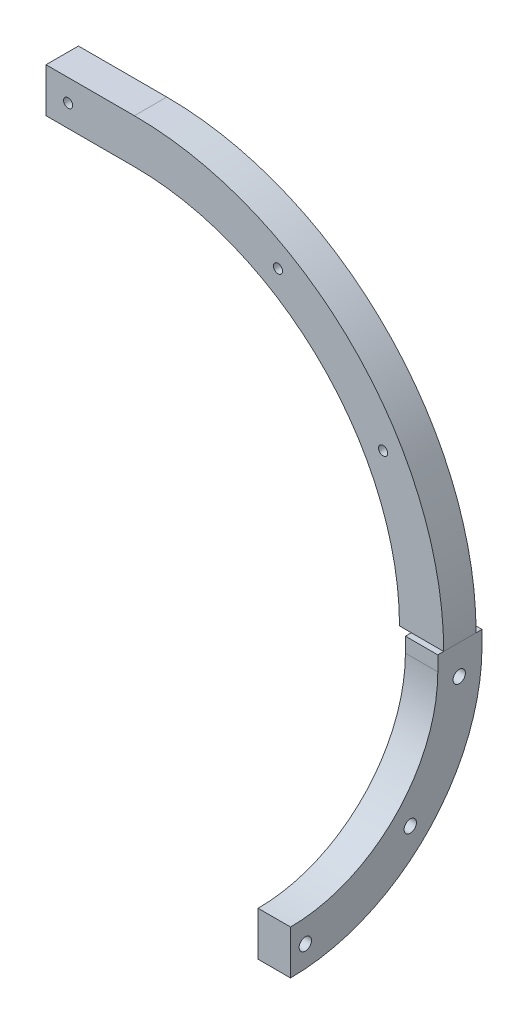
ISO-10303-21;
HEADER;
FILE_DESCRIPTION(('STEP AP214'),'2;1');
FILE_NAME('part.step','',(''),(''),'','','');
FILE_SCHEMA(('AUTOMOTIVE_DESIGN { 1 0 10303 214 1 1 1 1 }'));
ENDSEC;
DATA;
#1=APPLICATION_CONTEXT('core data for automotive mechanical design processes');
#2=APPLICATION_PROTOCOL_DEFINITION('international standard','automotive_design',2000,#1);
#3=PRODUCT_CONTEXT('',#1,'mechanical');
#4=PRODUCT('Part','Part','',(#3));
#5=PRODUCT_RELATED_PRODUCT_CATEGORY('part','',(#4));
#6=PRODUCT_DEFINITION_FORMATION('','',#4);
#7=PRODUCT_DEFINITION_CONTEXT('part definition',#1,'design');
#8=PRODUCT_DEFINITION('design','',#6,#7);
#9=PRODUCT_DEFINITION_SHAPE('','',#8);
#10=(LENGTH_UNIT() NAMED_UNIT(*) SI_UNIT(.MILLI.,.METRE.));
#11=(NAMED_UNIT(*) PLANE_ANGLE_UNIT() SI_UNIT($,.RADIAN.));
#12=(NAMED_UNIT(*) SI_UNIT($,.STERADIAN.) SOLID_ANGLE_UNIT());
#13=UNCERTAINTY_MEASURE_WITH_UNIT(LENGTH_MEASURE(1.E-05),#10,'distance_accuracy_value','');
#14=(GEOMETRIC_REPRESENTATION_CONTEXT(3) GLOBAL_UNCERTAINTY_ASSIGNED_CONTEXT((#13)) GLOBAL_UNIT_ASSIGNED_CONTEXT((#10,
#11,#12)) REPRESENTATION_CONTEXT('',''));
#15=CARTESIAN_POINT('',(0.,0.,0.));
#16=DIRECTION('',(0.,0.,1.));
#17=DIRECTION('',(1.,0.,0.));
#18=AXIS2_PLACEMENT_3D('',#15,#16,#17);
#19=CARTESIAN_POINT('',(0.,-45.6586399182266,9.3413600817736));
#20=DIRECTION('',(1.,0.,0.));
#21=DIRECTION('',(0.,0.,1.));
#22=AXIS2_PLACEMENT_3D('',#19,#20,#21);
#23=CYLINDRICAL_SURFACE('',#22,1.55);
#24=CARTESIAN_POINT('',(94.,-45.6586399182266,9.3413600817736));
#25=DIRECTION('',(1.,0.,0.));
#26=DIRECTION('',(0.,0.,-1.));
#27=AXIS2_PLACEMENT_3D('',#24,#25,#26);
#28=CIRCLE('',#27,1.55);
#29=CARTESIAN_POINT('',(94.,-45.6586399182266,7.7913600817736));
#30=VERTEX_POINT('',#29);
#31=EDGE_CURVE('E254',#30,#30,#28,.F.);
#32=ORIENTED_EDGE('',*,*,#31,.T.);
#33=EDGE_LOOP('',(#32));
#34=FACE_BOUND('',#33,.T.);
#35=CARTESIAN_POINT('',(100.5,-45.6586399182266,9.3413600817736));
#36=DIRECTION('',(-1.,0.,0.));
#37=DIRECTION('',(0.,0.,1.));
#38=AXIS2_PLACEMENT_3D('',#35,#36,#37);
#39=CIRCLE('',#38,1.55);
#40=CARTESIAN_POINT('',(100.5,-45.6586399182266,10.8913600817736));
#41=VERTEX_POINT('',#40);
#42=EDGE_CURVE('E177',#41,#41,#39,.F.);
#43=ORIENTED_EDGE('',*,*,#42,.T.);
#44=EDGE_LOOP('',(#43));
#45=FACE_BOUND('',#44,.T.);
#46=ADVANCED_FACE('F47',(#34,#45),#23,.F.);
#47=CARTESIAN_POINT('',(0.,-10.01145520799,-7.2811951402754));
#48=DIRECTION('',(1.,0.,0.));
#49=DIRECTION('',(0.,0.,1.));
#50=AXIS2_PLACEMENT_3D('',#47,#48,#49);
#51=CYLINDRICAL_SURFACE('',#50,1.55);
#52=CARTESIAN_POINT('',(94.,-10.01145520799,-7.2811951402754));
#53=DIRECTION('',(1.,0.,0.));
#54=DIRECTION('',(0.,0.,-1.));
#55=AXIS2_PLACEMENT_3D('',#52,#53,#54);
#56=CIRCLE('',#55,1.55);
#57=CARTESIAN_POINT('',(94.,-10.01145520799,-8.8311951402754));
#58=VERTEX_POINT('',#57);
#59=EDGE_CURVE('E250',#58,#58,#56,.F.);
#60=ORIENTED_EDGE('',*,*,#59,.T.);
#61=EDGE_LOOP('',(#60));
#62=FACE_BOUND('',#61,.T.);
#63=CARTESIAN_POINT('',(100.5,-10.01145520799,-7.2811951402754));
#64=DIRECTION('',(-1.,0.,0.));
#65=DIRECTION('',(0.,0.,1.));
#66=AXIS2_PLACEMENT_3D('',#63,#64,#65);
#67=CIRCLE('',#66,1.55);
#68=CARTESIAN_POINT('',(100.5,-10.01145520799,-5.7311951402754));
#69=VERTEX_POINT('',#68);
#70=EDGE_CURVE('E187',#69,#69,#67,.F.);
#71=ORIENTED_EDGE('',*,*,#70,.T.);
#72=EDGE_LOOP('',(#71));
#73=FACE_BOUND('',#72,.T.);
#74=ADVANCED_FACE('F332',(#62,#73),#51,.F.);
#75=CARTESIAN_POINT('',(0.,-62.5,44.9694018472598));
#76=DIRECTION('',(1.,0.,0.));
#77=DIRECTION('',(0.,0.,1.));
#78=AXIS2_PLACEMENT_3D('',#75,#76,#77);
#79=CYLINDRICAL_SURFACE('',#78,1.55);
#80=CARTESIAN_POINT('',(94.,-62.5,44.9694018472598));
#81=DIRECTION('',(1.,0.,0.));
#82=DIRECTION('',(0.,0.,-1.));
#83=AXIS2_PLACEMENT_3D('',#80,#81,#82);
#84=CIRCLE('',#83,1.55);
#85=CARTESIAN_POINT('',(94.,-62.5,43.4194018472598));
#86=VERTEX_POINT('',#85);
#87=EDGE_CURVE('E158',#86,#86,#84,.F.);
#88=ORIENTED_EDGE('',*,*,#87,.T.);
#89=EDGE_LOOP('',(#88));
#90=FACE_BOUND('',#89,.T.);
#91=CARTESIAN_POINT('',(100.5,-62.5,44.9694018472598));
#92=DIRECTION('',(-1.,0.,0.));
#93=DIRECTION('',(0.,0.,1.));
#94=AXIS2_PLACEMENT_3D('',#91,#92,#93);
#95=CIRCLE('',#94,1.55);
#96=CARTESIAN_POINT('',(100.5,-62.5,46.5194018472598));
#97=VERTEX_POINT('',#96);
#98=EDGE_CURVE('E322',#97,#97,#95,.F.);
#99=ORIENTED_EDGE('',*,*,#98,.T.);
#100=EDGE_LOOP('',(#99));
#101=FACE_BOUND('',#100,.T.);
#102=ADVANCED_FACE('F358',(#90,#101),#79,.F.);
#103=CARTESIAN_POINT('',(0.,0.,0.));
#104=DIRECTION('',(0.,0.,1.));
#105=DIRECTION('',(-1.,0.,0.));
#106=AXIS2_PLACEMENT_3D('',#103,#104,#105);
#107=PLANE('',#106);
#108=DIRECTION('',(1.,0.,0.));
#109=VECTOR('',#108,1.);
#110=CARTESIAN_POINT('',(90.,-5.,0.));
#111=LINE('',#110,#109);
#112=CARTESIAN_POINT('',(94.,-5.,0.));
#113=VERTEX_POINT('',#112);
#114=CARTESIAN_POINT('',(105.,-5.,0.));
#115=VERTEX_POINT('',#114);
#116=EDGE_CURVE('E169',#113,#115,#111,.T.);
#117=ORIENTED_EDGE('',*,*,#116,.T.);
#118=DIRECTION('',(0.,1.,0.));
#119=VECTOR('',#118,1.);
#120=CARTESIAN_POINT('',(105.,-5.,0.));
#121=LINE('',#120,#119);
#122=CARTESIAN_POINT('',(105.,0.,0.));
#123=VERTEX_POINT('',#122);
#124=EDGE_CURVE('E299',#115,#123,#121,.T.);
#125=ORIENTED_EDGE('',*,*,#124,.T.);
#126=DIRECTION('',(1.,0.,0.));
#127=VECTOR('',#126,1.);
#128=CARTESIAN_POINT('',(90.,0.,0.));
#129=LINE('',#128,#127);
#130=CARTESIAN_POINT('',(94.,0.,0.));
#131=VERTEX_POINT('',#130);
#132=EDGE_CURVE('E223',#131,#123,#129,.T.);
#133=ORIENTED_EDGE('',*,*,#132,.F.);
#134=DIRECTION('',(0.,1.,0.));
#135=VECTOR('',#134,1.);
#136=CARTESIAN_POINT('',(94.,0.,0.));
#137=LINE('',#136,#135);
#138=EDGE_CURVE('E193',#113,#131,#137,.T.);
#139=ORIENTED_EDGE('',*,*,#138,.F.);
#140=EDGE_LOOP('',(#117,#125,#133,#139));
#141=FACE_BOUND('',#140,.T.);
#142=ADVANCED_FACE('F391',(#141),#107,.T.);
#143=CARTESIAN_POINT('',(0.,0.,-15.));
#144=DIRECTION('',(0.,0.,1.));
#145=DIRECTION('',(-1.,0.,0.));
#146=AXIS2_PLACEMENT_3D('',#143,#144,#145);
#147=PLANE('',#146);
#148=DIRECTION('',(0.,-1.,0.));
#149=VECTOR('',#148,1.);
#150=CARTESIAN_POINT('',(94.,0.,-15.));
#151=LINE('',#150,#149);
#152=CARTESIAN_POINT('',(94.,0.,-15.));
#153=VERTEX_POINT('',#152);
#154=CARTESIAN_POINT('',(94.,-5.,-15.));
#155=VERTEX_POINT('',#154);
#156=EDGE_CURVE('E165',#153,#155,#151,.T.);
#157=ORIENTED_EDGE('',*,*,#156,.F.);
#158=DIRECTION('',(1.,0.,0.));
#159=VECTOR('',#158,1.);
#160=CARTESIAN_POINT('',(90.,0.,-15.));
#161=LINE('',#160,#159);
#162=CARTESIAN_POINT('',(105.,0.,-15.));
#163=VERTEX_POINT('',#162);
#164=EDGE_CURVE('E258',#153,#163,#161,.T.);
#165=ORIENTED_EDGE('',*,*,#164,.T.);
#166=DIRECTION('',(0.,1.,0.));
#167=VECTOR('',#166,1.);
#168=CARTESIAN_POINT('',(105.,-5.,-15.));
#169=LINE('',#168,#167);
#170=CARTESIAN_POINT('',(105.,-5.,-15.));
#171=VERTEX_POINT('',#170);
#172=EDGE_CURVE('E167',#171,#163,#169,.T.);
#173=ORIENTED_EDGE('',*,*,#172,.F.);
#174=DIRECTION('',(-1.,0.,0.));
#175=VECTOR('',#174,1.);
#176=CARTESIAN_POINT('',(90.,-5.,-15.));
#177=LINE('',#176,#175);
#178=EDGE_CURVE('E150',#171,#155,#177,.T.);
#179=ORIENTED_EDGE('',*,*,#178,.T.);
#180=EDGE_LOOP('',(#157,#165,#173,#179));
#181=FACE_BOUND('',#180,.T.);
#182=ADVANCED_FACE('F163',(#181),#147,.F.);
#183=CARTESIAN_POINT('',(90.,0.,-13.));
#184=DIRECTION('',(0.,-1.,0.));
#185=DIRECTION('',(0.,0.,1.));
#186=AXIS2_PLACEMENT_3D('',#183,#184,#185);
#187=PLANE('',#186);
#188=DIRECTION('',(0.,0.,-1.));
#189=VECTOR('',#188,1.);
#190=CARTESIAN_POINT('',(94.,0.,0.));
#191=LINE('',#190,#189);
#192=CARTESIAN_POINT('',(94.,0.,-13.));
#193=VERTEX_POINT('',#192);
#194=EDGE_CURVE('E174',#193,#153,#191,.T.);
#195=ORIENTED_EDGE('',*,*,#194,.F.);
#196=DIRECTION('',(1.,0.,0.));
#197=VECTOR('',#196,1.);
#198=CARTESIAN_POINT('',(90.,0.,-13.));
#199=LINE('',#198,#197);
#200=CARTESIAN_POINT('',(105.,0.,-13.));
#201=VERTEX_POINT('',#200);
#202=EDGE_CURVE('E267',#193,#201,#199,.T.);
#203=ORIENTED_EDGE('',*,*,#202,.T.);
#204=DIRECTION('',(0.,0.,1.));
#205=VECTOR('',#204,1.);
#206=CARTESIAN_POINT('',(105.,0.,-15.));
#207=LINE('',#206,#205);
#208=EDGE_CURVE('E303',#163,#201,#207,.T.);
#209=ORIENTED_EDGE('',*,*,#208,.F.);
#210=ORIENTED_EDGE('',*,*,#164,.F.);
#211=EDGE_LOOP('',(#195,#203,#209,#210));
#212=FACE_BOUND('',#211,.T.);
#213=ADVANCED_FACE('F390',(#212),#187,.F.);
#214=CARTESIAN_POINT('',(90.,0.,-2.));
#215=DIRECTION('',(0.,1.,0.));
#216=DIRECTION('',(0.,0.,-1.));
#217=AXIS2_PLACEMENT_3D('',#214,#215,#216);
#218=PLANE('',#217);
#219=ORIENTED_EDGE('',*,*,#132,.T.);
#220=DIRECTION('',(0.,0.,1.));
#221=VECTOR('',#220,1.);
#222=CARTESIAN_POINT('',(105.,0.,-2.));
#223=LINE('',#222,#221);
#224=CARTESIAN_POINT('',(105.,0.,-2.));
#225=VERTEX_POINT('',#224);
#226=EDGE_CURVE('E234',#225,#123,#223,.T.);
#227=ORIENTED_EDGE('',*,*,#226,.F.);
#228=DIRECTION('',(1.,0.,0.));
#229=VECTOR('',#228,1.);
#230=CARTESIAN_POINT('',(90.,0.,-2.));
#231=LINE('',#230,#229);
#232=CARTESIAN_POINT('',(94.,0.,-2.));
#233=VERTEX_POINT('',#232);
#234=EDGE_CURVE('E231',#233,#225,#231,.T.);
#235=ORIENTED_EDGE('',*,*,#234,.F.);
#236=EDGE_CURVE('E184',#131,#233,#191,.T.);
#237=ORIENTED_EDGE('',*,*,#236,.F.);
#238=EDGE_LOOP('',(#219,#227,#235,#237));
#239=FACE_BOUND('',#238,.T.);
#240=ADVANCED_FACE('F399',(#239),#218,.T.);
#241=CARTESIAN_POINT('',(0.,0.,-15.));
#242=DIRECTION('',(0.,0.,1.));
#243=DIRECTION('',(-1.,0.,0.));
#244=AXIS2_PLACEMENT_3D('',#241,#242,#243);
#245=CYLINDRICAL_SURFACE('',#244,105.);
#246=CARTESIAN_POINT('',(0.,0.,-2.));
#247=DIRECTION('',(0.,0.,1.));
#248=DIRECTION('',(-1.,0.,0.));
#249=AXIS2_PLACEMENT_3D('',#246,#247,#248);
#250=CIRCLE('',#249,105.);
#251=CARTESIAN_POINT('',(0.,105.,-2.));
#252=VERTEX_POINT('',#251);
#253=EDGE_CURVE('E224',#225,#252,#250,.T.);
#254=ORIENTED_EDGE('',*,*,#253,.F.);
#255=EDGE_CURVE('E73',#201,#225,#207,.T.);
#256=ORIENTED_EDGE('',*,*,#255,.F.);
#257=CARTESIAN_POINT('',(0.,0.,-13.));
#258=DIRECTION('',(0.,0.,1.));
#259=DIRECTION('',(-1.,0.,0.));
#260=AXIS2_PLACEMENT_3D('',#257,#258,#259);
#261=CIRCLE('',#260,105.);
#262=CARTESIAN_POINT('',(0.,105.,-13.));
#263=VERTEX_POINT('',#262);
#264=EDGE_CURVE('E259',#201,#263,#261,.T.);
#265=ORIENTED_EDGE('',*,*,#264,.T.);
#266=DIRECTION('',(0.,0.,1.));
#267=VECTOR('',#266,1.);
#268=CARTESIAN_POINT('',(0.,105.,-15.));
#269=LINE('',#268,#267);
#270=EDGE_CURVE('E11',#263,#252,#269,.T.);
#271=ORIENTED_EDGE('',*,*,#270,.T.);
#272=EDGE_LOOP('',(#254,#256,#265,#271));
#273=FACE_BOUND('',#272,.T.);
#274=ADVANCED_FACE('F49',(#273),#245,.T.);
#275=CARTESIAN_POINT('',(0.,0.,-15.));
#276=DIRECTION('',(0.,0.,1.));
#277=DIRECTION('',(-1.,0.,0.));
#278=AXIS2_PLACEMENT_3D('',#275,#276,#277);
#279=CYLINDRICAL_SURFACE('',#278,90.);
#280=CARTESIAN_POINT('',(0.,0.,-2.));
#281=DIRECTION('',(0.,0.,-1.));
#282=DIRECTION('',(-1.,0.,0.));
#283=AXIS2_PLACEMENT_3D('',#280,#281,#282);
#284=CIRCLE('',#283,90.);
#285=CARTESIAN_POINT('',(-3.14233320495882E-13,90.,-2.));
#286=VERTEX_POINT('',#285);
#287=CARTESIAN_POINT('',(90.,0.,-2.));
#288=VERTEX_POINT('',#287);
#289=EDGE_CURVE('E228',#286,#288,#284,.T.);
#290=ORIENTED_EDGE('',*,*,#289,.F.);
#291=DIRECTION('',(0.,0.,1.));
#292=VECTOR('',#291,1.);
#293=CARTESIAN_POINT('',(0.,90.,-15.));
#294=LINE('',#293,#292);
#295=CARTESIAN_POINT('',(-3.14233320495882E-13,90.,-13.));
#296=VERTEX_POINT('',#295);
#297=EDGE_CURVE('E57',#296,#286,#294,.T.);
#298=ORIENTED_EDGE('',*,*,#297,.F.);
#299=CARTESIAN_POINT('',(0.,0.,-13.));
#300=DIRECTION('',(0.,0.,-1.));
#301=DIRECTION('',(-1.,0.,0.));
#302=AXIS2_PLACEMENT_3D('',#299,#300,#301);
#303=CIRCLE('',#302,90.);
#304=CARTESIAN_POINT('',(90.,0.,-13.));
#305=VERTEX_POINT('',#304);
#306=EDGE_CURVE('E263',#296,#305,#303,.T.);
#307=ORIENTED_EDGE('',*,*,#306,.T.);
#308=DIRECTION('',(0.,0.,1.));
#309=VECTOR('',#308,1.);
#310=CARTESIAN_POINT('',(90.,0.,-15.));
#311=LINE('',#310,#309);
#312=EDGE_CURVE('E306',#305,#288,#311,.T.);
#313=ORIENTED_EDGE('',*,*,#312,.T.);
#314=EDGE_LOOP('',(#290,#298,#307,#313));
#315=FACE_BOUND('',#314,.T.);
#316=ADVANCED_FACE('F372',(#315),#279,.F.);
#317=CARTESIAN_POINT('',(84.4374768689824,48.7500000000007,50.));
#318=DIRECTION('',(0.,0.,-1.));
#319=DIRECTION('',(1.,0.,0.));
#320=AXIS2_PLACEMENT_3D('',#317,#318,#319);
#321=CYLINDRICAL_SURFACE('',#320,1.54999999999999);
#322=CARTESIAN_POINT('',(84.4374768689824,48.7500000000007,-13.));
#323=DIRECTION('',(0.,0.,-1.));
#324=DIRECTION('',(-1.,0.,0.));
#325=AXIS2_PLACEMENT_3D('',#322,#323,#324);
#326=CIRCLE('',#325,1.54999999999999);
#327=CARTESIAN_POINT('',(82.8874768689824,48.7500000000007,-13.));
#328=VERTEX_POINT('',#327);
#329=EDGE_CURVE('E275',#328,#328,#326,.F.);
#330=ORIENTED_EDGE('',*,*,#329,.F.);
#331=EDGE_LOOP('',(#330));
#332=FACE_BOUND('',#331,.T.);
#333=CARTESIAN_POINT('',(84.4374768689824,48.7500000000007,-2.));
#334=DIRECTION('',(0.,0.,-1.));
#335=DIRECTION('',(-1.,0.,0.));
#336=AXIS2_PLACEMENT_3D('',#333,#334,#335);
#337=CIRCLE('',#336,1.54999999999999);
#338=CARTESIAN_POINT('',(82.8874768689824,48.7500000000007,-2.));
#339=VERTEX_POINT('',#338);
#340=EDGE_CURVE('E241',#339,#339,#337,.F.);
#341=ORIENTED_EDGE('',*,*,#340,.T.);
#342=EDGE_LOOP('',(#341));
#343=FACE_BOUND('',#342,.T.);
#344=ADVANCED_FACE('F368',(#332,#343),#321,.F.);
#345=CARTESIAN_POINT('',(48.7500000000004,84.4374768689825,50.));
#346=DIRECTION('',(0.,0.,-1.));
#347=DIRECTION('',(1.,0.,0.));
#348=AXIS2_PLACEMENT_3D('',#345,#346,#347);
#349=CYLINDRICAL_SURFACE('',#348,1.54999999999999);
#350=CARTESIAN_POINT('',(48.7500000000004,84.4374768689825,-13.));
#351=DIRECTION('',(0.,0.,-1.));
#352=DIRECTION('',(-1.,0.,0.));
#353=AXIS2_PLACEMENT_3D('',#350,#351,#352);
#354=CIRCLE('',#353,1.54999999999999);
#355=CARTESIAN_POINT('',(47.2000000000004,84.4374768689825,-13.));
#356=VERTEX_POINT('',#355);
#357=EDGE_CURVE('E272',#356,#356,#354,.F.);
#358=ORIENTED_EDGE('',*,*,#357,.F.);
#359=EDGE_LOOP('',(#358));
#360=FACE_BOUND('',#359,.T.);
#361=CARTESIAN_POINT('',(48.7500000000004,84.4374768689825,-2.));
#362=DIRECTION('',(0.,0.,-1.));
#363=DIRECTION('',(-1.,0.,0.));
#364=AXIS2_PLACEMENT_3D('',#361,#362,#363);
#365=CIRCLE('',#364,1.54999999999999);
#366=CARTESIAN_POINT('',(47.2000000000004,84.4374768689825,-2.));
#367=VERTEX_POINT('',#366);
#368=EDGE_CURVE('E240',#367,#367,#365,.F.);
#369=ORIENTED_EDGE('',*,*,#368,.T.);
#370=EDGE_LOOP('',(#369));
#371=FACE_BOUND('',#370,.T.);
#372=ADVANCED_FACE('F364',(#360,#371),#349,.F.);
#373=CARTESIAN_POINT('',(90.,-5.,50.));
#374=DIRECTION('',(1.,0.,0.));
#375=DIRECTION('',(0.,0.,1.));
#376=AXIS2_PLACEMENT_3D('',#373,#374,#375);
#377=CYLINDRICAL_SURFACE('',#376,50.);
#378=DIRECTION('',(1.,0.,0.));
#379=VECTOR('',#378,1.);
#380=CARTESIAN_POINT('',(90.,-55.,50.));
#381=LINE('',#380,#379);
#382=CARTESIAN_POINT('',(94.,-55.,50.));
#383=VERTEX_POINT('',#382);
#384=CARTESIAN_POINT('',(105.,-55.,50.));
#385=VERTEX_POINT('',#384);
#386=EDGE_CURVE('E288',#383,#385,#381,.T.);
#387=ORIENTED_EDGE('',*,*,#386,.T.);
#388=CARTESIAN_POINT('',(105.,-5.,50.));
#389=DIRECTION('',(1.,0.,0.));
#390=DIRECTION('',(0.,0.,1.));
#391=AXIS2_PLACEMENT_3D('',#388,#389,#390);
#392=CIRCLE('',#391,50.);
#393=EDGE_CURVE('E279',#385,#115,#392,.T.);
#394=ORIENTED_EDGE('',*,*,#393,.T.);
#395=ORIENTED_EDGE('',*,*,#116,.F.);
#396=CARTESIAN_POINT('',(94.,-5.,50.));
#397=DIRECTION('',(-1.,0.,0.));
#398=DIRECTION('',(0.,0.,-1.));
#399=AXIS2_PLACEMENT_3D('',#396,#397,#398);
#400=CIRCLE('',#399,50.);
#401=EDGE_CURVE('E244',#113,#383,#400,.T.);
#402=ORIENTED_EDGE('',*,*,#401,.T.);
#403=EDGE_LOOP('',(#387,#394,#395,#402));
#404=FACE_BOUND('',#403,.T.);
#405=ADVANCED_FACE('F367',(#404),#377,.F.);
#406=CARTESIAN_POINT('',(90.,-55.,50.));
#407=DIRECTION('',(0.,0.,1.));
#408=DIRECTION('',(0.,1.,0.));
#409=AXIS2_PLACEMENT_3D('',#406,#407,#408);
#410=PLANE('',#409);
#411=DIRECTION('',(1.,0.,0.));
#412=VECTOR('',#411,1.);
#413=CARTESIAN_POINT('',(90.,-70.,50.));
#414=LINE('',#413,#412);
#415=CARTESIAN_POINT('',(94.,-70.,50.));
#416=VERTEX_POINT('',#415);
#417=CARTESIAN_POINT('',(105.,-70.,50.));
#418=VERTEX_POINT('',#417);
#419=EDGE_CURVE('E153',#416,#418,#414,.T.);
#420=ORIENTED_EDGE('',*,*,#419,.T.);
#421=DIRECTION('',(0.,1.,0.));
#422=VECTOR('',#421,1.);
#423=CARTESIAN_POINT('',(105.,-55.,50.));
#424=LINE('',#423,#422);
#425=EDGE_CURVE('E285',#418,#385,#424,.T.);
#426=ORIENTED_EDGE('',*,*,#425,.T.);
#427=ORIENTED_EDGE('',*,*,#386,.F.);
#428=DIRECTION('',(0.,-1.,0.));
#429=VECTOR('',#428,1.);
#430=CARTESIAN_POINT('',(94.,-55.,50.));
#431=LINE('',#430,#429);
#432=EDGE_CURVE('E159',#383,#416,#431,.T.);
#433=ORIENTED_EDGE('',*,*,#432,.T.);
#434=EDGE_LOOP('',(#420,#426,#427,#433));
#435=FACE_BOUND('',#434,.T.);
#436=ADVANCED_FACE('F374',(#435),#410,.T.);
#437=CARTESIAN_POINT('',(90.,-5.,50.));
#438=DIRECTION('',(1.,0.,0.));
#439=DIRECTION('',(0.,0.,1.));
#440=AXIS2_PLACEMENT_3D('',#437,#438,#439);
#441=CYLINDRICAL_SURFACE('',#440,65.);
#442=ORIENTED_EDGE('',*,*,#178,.F.);
#443=CARTESIAN_POINT('',(105.,-5.,50.));
#444=DIRECTION('',(-1.,0.,0.));
#445=DIRECTION('',(0.,0.,1.));
#446=AXIS2_PLACEMENT_3D('',#443,#444,#445);
#447=CIRCLE('',#446,65.);
#448=EDGE_CURVE('E282',#171,#418,#447,.T.);
#449=ORIENTED_EDGE('',*,*,#448,.T.);
#450=ORIENTED_EDGE('',*,*,#419,.F.);
#451=CARTESIAN_POINT('',(94.,-5.,50.));
#452=DIRECTION('',(1.,0.,0.));
#453=DIRECTION('',(0.,0.,-1.));
#454=AXIS2_PLACEMENT_3D('',#451,#452,#453);
#455=CIRCLE('',#454,65.);
#456=EDGE_CURVE('E147',#416,#155,#455,.T.);
#457=ORIENTED_EDGE('',*,*,#456,.T.);
#458=EDGE_LOOP('',(#442,#449,#450,#457));
#459=FACE_BOUND('',#458,.T.);
#460=ADVANCED_FACE('F149',(#459),#441,.T.);
#461=CARTESIAN_POINT('',(105.,-5.,-15.));
#462=DIRECTION('',(-1.,0.,0.));
#463=DIRECTION('',(0.,0.,-1.));
#464=AXIS2_PLACEMENT_3D('',#461,#462,#463);
#465=PLANE('',#464);
#466=CARTESIAN_POINT('',(105.,-10.01145520799,-7.2811951402754));
#467=DIRECTION('',(-1.,0.,0.));
#468=DIRECTION('',(0.,0.,1.));
#469=AXIS2_PLACEMENT_3D('',#466,#467,#468);
#470=CIRCLE('',#469,2.1);
#471=CARTESIAN_POINT('',(105.,-10.01145520799,-5.1811951402754));
#472=VERTEX_POINT('',#471);
#473=EDGE_CURVE('E429',#472,#472,#470,.T.);
#474=ORIENTED_EDGE('',*,*,#473,.T.);
#475=EDGE_LOOP('',(#474));
#476=FACE_BOUND('',#475,.T.);
#477=CARTESIAN_POINT('',(105.,-45.6586399182266,9.3413600817736));
#478=DIRECTION('',(-1.,0.,0.));
#479=DIRECTION('',(0.,0.,1.));
#480=AXIS2_PLACEMENT_3D('',#477,#478,#479);
#481=CIRCLE('',#480,2.1);
#482=CARTESIAN_POINT('',(105.,-45.6586399182266,11.4413600817736));
#483=VERTEX_POINT('',#482);
#484=EDGE_CURVE('E431',#483,#483,#481,.T.);
#485=ORIENTED_EDGE('',*,*,#484,.T.);
#486=EDGE_LOOP('',(#485));
#487=FACE_BOUND('',#486,.T.);
#488=CARTESIAN_POINT('',(105.,-62.5,44.9694018472598));
#489=DIRECTION('',(-1.,0.,0.));
#490=DIRECTION('',(0.,0.,1.));
#491=AXIS2_PLACEMENT_3D('',#488,#489,#490);
#492=CIRCLE('',#491,2.1);
#493=CARTESIAN_POINT('',(105.,-62.5,47.0694018472598));
#494=VERTEX_POINT('',#493);
#495=EDGE_CURVE('E436',#494,#494,#492,.T.);
#496=ORIENTED_EDGE('',*,*,#495,.T.);
#497=EDGE_LOOP('',(#496));
#498=FACE_BOUND('',#497,.T.);
#499=ORIENTED_EDGE('',*,*,#208,.T.);
#500=ORIENTED_EDGE('',*,*,#255,.T.);
#501=ORIENTED_EDGE('',*,*,#226,.T.);
#502=ORIENTED_EDGE('',*,*,#124,.F.);
#503=ORIENTED_EDGE('',*,*,#393,.F.);
#504=ORIENTED_EDGE('',*,*,#425,.F.);
#505=ORIENTED_EDGE('',*,*,#448,.F.);
#506=ORIENTED_EDGE('',*,*,#172,.T.);
#507=EDGE_LOOP('',(#499,#500,#501,#502,#503,#504,#505,#506));
#508=FACE_BOUND('',#507,.T.);
#509=ADVANCED_FACE('F380',(#476,#487,#498,#508),#465,.F.);
#510=CARTESIAN_POINT('',(0.,0.,-13.));
#511=DIRECTION('',(0.,0.,1.));
#512=DIRECTION('',(-1.,0.,0.));
#513=AXIS2_PLACEMENT_3D('',#510,#511,#512);
#514=PLANE('',#513);
#515=CARTESIAN_POINT('',(-22.5,97.5,-13.));
#516=DIRECTION('',(0.,0.,1.));
#517=DIRECTION('',(1.,0.,0.));
#518=AXIS2_PLACEMENT_3D('',#515,#516,#517);
#519=CIRCLE('',#518,1.55);
#520=CARTESIAN_POINT('',(-20.95,97.5,-13.));
#521=VERTEX_POINT('',#520);
#522=EDGE_CURVE('E447',#521,#521,#519,.T.);
#523=ORIENTED_EDGE('',*,*,#522,.T.);
#524=EDGE_LOOP('',(#523));
#525=FACE_BOUND('',#524,.T.);
#526=ORIENTED_EDGE('',*,*,#357,.T.);
#527=EDGE_LOOP('',(#526));
#528=FACE_BOUND('',#527,.T.);
#529=ORIENTED_EDGE('',*,*,#264,.F.);
#530=ORIENTED_EDGE('',*,*,#202,.F.);
#531=EDGE_CURVE('E268',#305,#193,#199,.T.);
#532=ORIENTED_EDGE('',*,*,#531,.F.);
#533=ORIENTED_EDGE('',*,*,#306,.F.);
#534=DIRECTION('',(1.,0.,0.));
#535=VECTOR('',#534,1.);
#536=CARTESIAN_POINT('',(-30.,90.,-13.));
#537=LINE('',#536,#535);
#538=CARTESIAN_POINT('',(-30.,90.,-13.));
#539=VERTEX_POINT('',#538);
#540=EDGE_CURVE('E217',#539,#296,#537,.T.);
#541=ORIENTED_EDGE('',*,*,#540,.F.);
#542=DIRECTION('',(0.,1.,0.));
#543=VECTOR('',#542,1.);
#544=CARTESIAN_POINT('',(-30.,105.,-13.));
#545=LINE('',#544,#543);
#546=CARTESIAN_POINT('',(-30.,105.,-13.));
#547=VERTEX_POINT('',#546);
#548=EDGE_CURVE('E204',#539,#547,#545,.T.);
#549=ORIENTED_EDGE('',*,*,#548,.T.);
#550=DIRECTION('',(1.,0.,0.));
#551=VECTOR('',#550,1.);
#552=CARTESIAN_POINT('',(-30.,105.,-13.));
#553=LINE('',#552,#551);
#554=EDGE_CURVE('E214',#547,#263,#553,.T.);
#555=ORIENTED_EDGE('',*,*,#554,.T.);
#556=EDGE_LOOP('',(#529,#530,#532,#533,#541,#549,#555));
#557=FACE_BOUND('',#556,.T.);
#558=ORIENTED_EDGE('',*,*,#329,.T.);
#559=EDGE_LOOP('',(#558));
#560=FACE_BOUND('',#559,.T.);
#561=ADVANCED_FACE('F386',(#525,#528,#557,#560),#514,.F.);
#562=CARTESIAN_POINT('',(94.,-5.,50.));
#563=DIRECTION('',(-1.,0.,0.));
#564=DIRECTION('',(0.,0.,-1.));
#565=AXIS2_PLACEMENT_3D('',#562,#563,#564);
#566=PLANE('',#565);
#567=ORIENTED_EDGE('',*,*,#401,.F.);
#568=ORIENTED_EDGE('',*,*,#138,.T.);
#569=ORIENTED_EDGE('',*,*,#236,.T.);
#570=EDGE_CURVE('E182',#233,#193,#191,.T.);
#571=ORIENTED_EDGE('',*,*,#570,.T.);
#572=ORIENTED_EDGE('',*,*,#194,.T.);
#573=ORIENTED_EDGE('',*,*,#156,.T.);
#574=ORIENTED_EDGE('',*,*,#456,.F.);
#575=ORIENTED_EDGE('',*,*,#432,.F.);
#576=EDGE_LOOP('',(#567,#568,#569,#571,#572,#573,#574,#575));
#577=FACE_BOUND('',#576,.T.);
#578=ORIENTED_EDGE('',*,*,#87,.F.);
#579=EDGE_LOOP('',(#578));
#580=FACE_BOUND('',#579,.T.);
#581=ORIENTED_EDGE('',*,*,#59,.F.);
#582=EDGE_LOOP('',(#581));
#583=FACE_BOUND('',#582,.T.);
#584=ORIENTED_EDGE('',*,*,#31,.F.);
#585=EDGE_LOOP('',(#584));
#586=FACE_BOUND('',#585,.T.);
#587=ADVANCED_FACE('F171',(#577,#580,#583,#586),#566,.T.);
#588=CARTESIAN_POINT('',(0.,0.,-2.));
#589=DIRECTION('',(0.,0.,1.));
#590=DIRECTION('',(-1.,0.,0.));
#591=AXIS2_PLACEMENT_3D('',#588,#589,#590);
#592=PLANE('',#591);
#593=CARTESIAN_POINT('',(-22.5,97.5,-2.));
#594=DIRECTION('',(0.,0.,-1.));
#595=DIRECTION('',(-1.,0.,0.));
#596=AXIS2_PLACEMENT_3D('',#593,#594,#595);
#597=CIRCLE('',#596,1.55);
#598=CARTESIAN_POINT('',(-24.05,97.5,-2.));
#599=VERTEX_POINT('',#598);
#600=EDGE_CURVE('E51',#599,#599,#597,.T.);
#601=ORIENTED_EDGE('',*,*,#600,.T.);
#602=EDGE_LOOP('',(#601));
#603=FACE_BOUND('',#602,.T.);
#604=ORIENTED_EDGE('',*,*,#253,.T.);
#605=DIRECTION('',(1.,0.,0.));
#606=VECTOR('',#605,1.);
#607=CARTESIAN_POINT('',(-30.,105.,-2.));
#608=LINE('',#607,#606);
#609=CARTESIAN_POINT('',(-30.,105.,-2.));
#610=VERTEX_POINT('',#609);
#611=EDGE_CURVE('E211',#610,#252,#608,.T.);
#612=ORIENTED_EDGE('',*,*,#611,.F.);
#613=DIRECTION('',(0.,-1.,0.));
#614=VECTOR('',#613,1.);
#615=CARTESIAN_POINT('',(-30.,105.,-2.));
#616=LINE('',#615,#614);
#617=CARTESIAN_POINT('',(-30.,90.,-2.));
#618=VERTEX_POINT('',#617);
#619=EDGE_CURVE('E197',#610,#618,#616,.T.);
#620=ORIENTED_EDGE('',*,*,#619,.T.);
#621=DIRECTION('',(1.,0.,0.));
#622=VECTOR('',#621,1.);
#623=CARTESIAN_POINT('',(-30.,90.,-2.));
#624=LINE('',#623,#622);
#625=EDGE_CURVE('E220',#618,#286,#624,.T.);
#626=ORIENTED_EDGE('',*,*,#625,.T.);
#627=ORIENTED_EDGE('',*,*,#289,.T.);
#628=EDGE_CURVE('E65',#288,#233,#231,.T.);
#629=ORIENTED_EDGE('',*,*,#628,.T.);
#630=ORIENTED_EDGE('',*,*,#234,.T.);
#631=EDGE_LOOP('',(#604,#612,#620,#626,#627,#629,#630));
#632=FACE_BOUND('',#631,.T.);
#633=ORIENTED_EDGE('',*,*,#368,.F.);
#634=EDGE_LOOP('',(#633));
#635=FACE_BOUND('',#634,.T.);
#636=ORIENTED_EDGE('',*,*,#340,.F.);
#637=EDGE_LOOP('',(#636));
#638=FACE_BOUND('',#637,.T.);
#639=ADVANCED_FACE('F404',(#603,#632,#635,#638),#592,.T.);
#640=CARTESIAN_POINT('',(-30.,90.,-2.));
#641=DIRECTION('',(0.,1.,0.));
#642=DIRECTION('',(-1.,0.,0.));
#643=AXIS2_PLACEMENT_3D('',#640,#641,#642);
#644=PLANE('',#643);
#645=ORIENTED_EDGE('',*,*,#297,.T.);
#646=ORIENTED_EDGE('',*,*,#625,.F.);
#647=DIRECTION('',(0.,0.,-1.));
#648=VECTOR('',#647,1.);
#649=CARTESIAN_POINT('',(-30.,90.,-2.));
#650=LINE('',#649,#648);
#651=EDGE_CURVE('E201',#618,#539,#650,.T.);
#652=ORIENTED_EDGE('',*,*,#651,.T.);
#653=ORIENTED_EDGE('',*,*,#540,.T.);
#654=EDGE_LOOP('',(#645,#646,#652,#653));
#655=FACE_BOUND('',#654,.T.);
#656=ADVANCED_FACE('F410',(#655),#644,.F.);
#657=CARTESIAN_POINT('',(-30.,105.,-2.));
#658=DIRECTION('',(0.,-1.,0.));
#659=DIRECTION('',(1.,0.,0.));
#660=AXIS2_PLACEMENT_3D('',#657,#658,#659);
#661=PLANE('',#660);
#662=ORIENTED_EDGE('',*,*,#270,.F.);
#663=ORIENTED_EDGE('',*,*,#554,.F.);
#664=DIRECTION('',(0.,0.,1.));
#665=VECTOR('',#664,1.);
#666=CARTESIAN_POINT('',(-30.,105.,-2.));
#667=LINE('',#666,#665);
#668=EDGE_CURVE('E208',#547,#610,#667,.T.);
#669=ORIENTED_EDGE('',*,*,#668,.T.);
#670=ORIENTED_EDGE('',*,*,#611,.T.);
#671=EDGE_LOOP('',(#662,#663,#669,#670));
#672=FACE_BOUND('',#671,.T.);
#673=ADVANCED_FACE('F602',(#672),#661,.F.);
#674=CARTESIAN_POINT('',(-30.,0.,0.));
#675=DIRECTION('',(-1.,0.,0.));
#676=DIRECTION('',(0.,-1.,0.));
#677=AXIS2_PLACEMENT_3D('',#674,#675,#676);
#678=PLANE('',#677);
#679=ORIENTED_EDGE('',*,*,#619,.F.);
#680=ORIENTED_EDGE('',*,*,#668,.F.);
#681=ORIENTED_EDGE('',*,*,#548,.F.);
#682=ORIENTED_EDGE('',*,*,#651,.F.);
#683=EDGE_LOOP('',(#679,#680,#681,#682));
#684=FACE_BOUND('',#683,.T.);
#685=ADVANCED_FACE('F613',(#684),#678,.T.);
#686=CARTESIAN_POINT('',(109.811388300842,0.,0.));
#687=DIRECTION('',(0.,1.,0.));
#688=DIRECTION('',(0.,0.,-1.));
#689=AXIS2_PLACEMENT_3D('',#686,#687,#688);
#690=PLANE('',#689);
#691=ORIENTED_EDGE('',*,*,#312,.F.);
#692=ORIENTED_EDGE('',*,*,#531,.T.);
#693=ORIENTED_EDGE('',*,*,#570,.F.);
#694=ORIENTED_EDGE('',*,*,#628,.F.);
#695=EDGE_LOOP('',(#691,#692,#693,#694));
#696=FACE_BOUND('',#695,.T.);
#697=ADVANCED_FACE('F419',(#696),#690,.F.);
#698=CARTESIAN_POINT('',(100.5,-62.5,44.9694018472598));
#699=DIRECTION('',(1.,0.,0.));
#700=DIRECTION('',(0.,0.,1.));
#701=AXIS2_PLACEMENT_3D('',#698,#699,#700);
#702=PLANE('',#701);
#703=CARTESIAN_POINT('',(100.5,-62.5,44.9694018472598));
#704=DIRECTION('',(-1.,0.,0.));
#705=DIRECTION('',(0.,0.,1.));
#706=AXIS2_PLACEMENT_3D('',#703,#704,#705);
#707=CIRCLE('',#706,2.1);
#708=CARTESIAN_POINT('',(100.5,-62.5,47.0694018472598));
#709=VERTEX_POINT('',#708);
#710=EDGE_CURVE('E189',#709,#709,#707,.T.);
#711=ORIENTED_EDGE('',*,*,#710,.F.);
#712=EDGE_LOOP('',(#711));
#713=FACE_BOUND('',#712,.T.);
#714=ORIENTED_EDGE('',*,*,#98,.F.);
#715=EDGE_LOOP('',(#714));
#716=FACE_BOUND('',#715,.T.);
#717=ADVANCED_FACE('F463',(#713,#716),#702,.T.);
#718=CARTESIAN_POINT('',(100.5,-62.5,44.9694018472598));
#719=DIRECTION('',(1.,0.,0.));
#720=DIRECTION('',(0.,0.,1.));
#721=AXIS2_PLACEMENT_3D('',#718,#719,#720);
#722=CYLINDRICAL_SURFACE('',#721,2.1);
#723=ORIENTED_EDGE('',*,*,#710,.T.);
#724=EDGE_LOOP('',(#723));
#725=FACE_BOUND('',#724,.T.);
#726=ORIENTED_EDGE('',*,*,#495,.F.);
#727=EDGE_LOOP('',(#726));
#728=FACE_BOUND('',#727,.T.);
#729=ADVANCED_FACE('F460',(#725,#728),#722,.F.);
#730=CARTESIAN_POINT('',(100.5,-45.6586399182266,9.3413600817736));
#731=DIRECTION('',(1.,0.,0.));
#732=DIRECTION('',(0.,0.,1.));
#733=AXIS2_PLACEMENT_3D('',#730,#731,#732);
#734=PLANE('',#733);
#735=CARTESIAN_POINT('',(100.5,-45.6586399182266,9.3413600817736));
#736=DIRECTION('',(-1.,0.,0.));
#737=DIRECTION('',(0.,0.,1.));
#738=AXIS2_PLACEMENT_3D('',#735,#736,#737);
#739=CIRCLE('',#738,2.1);
#740=CARTESIAN_POINT('',(100.5,-45.6586399182266,11.4413600817736));
#741=VERTEX_POINT('',#740);
#742=EDGE_CURVE('E434',#741,#741,#739,.T.);
#743=ORIENTED_EDGE('',*,*,#742,.F.);
#744=EDGE_LOOP('',(#743));
#745=FACE_BOUND('',#744,.T.);
#746=ORIENTED_EDGE('',*,*,#42,.F.);
#747=EDGE_LOOP('',(#746));
#748=FACE_BOUND('',#747,.T.);
#749=ADVANCED_FACE('F347',(#745,#748),#734,.T.);
#750=CARTESIAN_POINT('',(100.5,-45.6586399182266,9.3413600817736));
#751=DIRECTION('',(1.,0.,0.));
#752=DIRECTION('',(0.,0.,1.));
#753=AXIS2_PLACEMENT_3D('',#750,#751,#752);
#754=CYLINDRICAL_SURFACE('',#753,2.1);
#755=ORIENTED_EDGE('',*,*,#742,.T.);
#756=EDGE_LOOP('',(#755));
#757=FACE_BOUND('',#756,.T.);
#758=ORIENTED_EDGE('',*,*,#484,.F.);
#759=EDGE_LOOP('',(#758));
#760=FACE_BOUND('',#759,.T.);
#761=ADVANCED_FACE('F337',(#757,#760),#754,.F.);
#762=CARTESIAN_POINT('',(100.5,-10.01145520799,-7.2811951402754));
#763=DIRECTION('',(1.,0.,0.));
#764=DIRECTION('',(0.,0.,1.));
#765=AXIS2_PLACEMENT_3D('',#762,#763,#764);
#766=PLANE('',#765);
#767=CARTESIAN_POINT('',(100.5,-10.01145520799,-7.2811951402754));
#768=DIRECTION('',(-1.,0.,0.));
#769=DIRECTION('',(0.,0.,1.));
#770=AXIS2_PLACEMENT_3D('',#767,#768,#769);
#771=CIRCLE('',#770,2.1);
#772=CARTESIAN_POINT('',(100.5,-10.01145520799,-5.1811951402754));
#773=VERTEX_POINT('',#772);
#774=EDGE_CURVE('E326',#773,#773,#771,.T.);
#775=ORIENTED_EDGE('',*,*,#774,.F.);
#776=EDGE_LOOP('',(#775));
#777=FACE_BOUND('',#776,.T.);
#778=ORIENTED_EDGE('',*,*,#70,.F.);
#779=EDGE_LOOP('',(#778));
#780=FACE_BOUND('',#779,.T.);
#781=ADVANCED_FACE('F334',(#777,#780),#766,.T.);
#782=CARTESIAN_POINT('',(100.5,-10.01145520799,-7.2811951402754));
#783=DIRECTION('',(1.,0.,0.));
#784=DIRECTION('',(0.,0.,1.));
#785=AXIS2_PLACEMENT_3D('',#782,#783,#784);
#786=CYLINDRICAL_SURFACE('',#785,2.1);
#787=ORIENTED_EDGE('',*,*,#774,.T.);
#788=EDGE_LOOP('',(#787));
#789=FACE_BOUND('',#788,.T.);
#790=ORIENTED_EDGE('',*,*,#473,.F.);
#791=EDGE_LOOP('',(#790));
#792=FACE_BOUND('',#791,.T.);
#793=ADVANCED_FACE('F336',(#789,#792),#786,.F.);
#794=CARTESIAN_POINT('',(-22.5,97.5,50.));
#795=DIRECTION('',(0.,0.,-1.));
#796=DIRECTION('',(1.,0.,0.));
#797=AXIS2_PLACEMENT_3D('',#794,#795,#796);
#798=CYLINDRICAL_SURFACE('',#797,1.55);
#799=ORIENTED_EDGE('',*,*,#600,.F.);
#800=EDGE_LOOP('',(#799));
#801=FACE_BOUND('',#800,.T.);
#802=ORIENTED_EDGE('',*,*,#522,.F.);
#803=EDGE_LOOP('',(#802));
#804=FACE_BOUND('',#803,.T.);
#805=ADVANCED_FACE('F344',(#801,#804),#798,.F.);
#806=CLOSED_SHELL('',(#46,#74,#102,#142,#182,#213,#240,#274,#316,#344,#372,#405,#436,#460,#509,
#561,#587,#639,#656,#673,#685,#697,#717,#729,#749,#761,#781,#793,#805));
#807=MANIFOLD_SOLID_BREP('B2',#806);
#808=ADVANCED_BREP_SHAPE_REPRESENTATION('',(#18,#807),#14);
#809=SHAPE_DEFINITION_REPRESENTATION(#9,#808);
ENDSEC;
END-ISO-10303-21;
